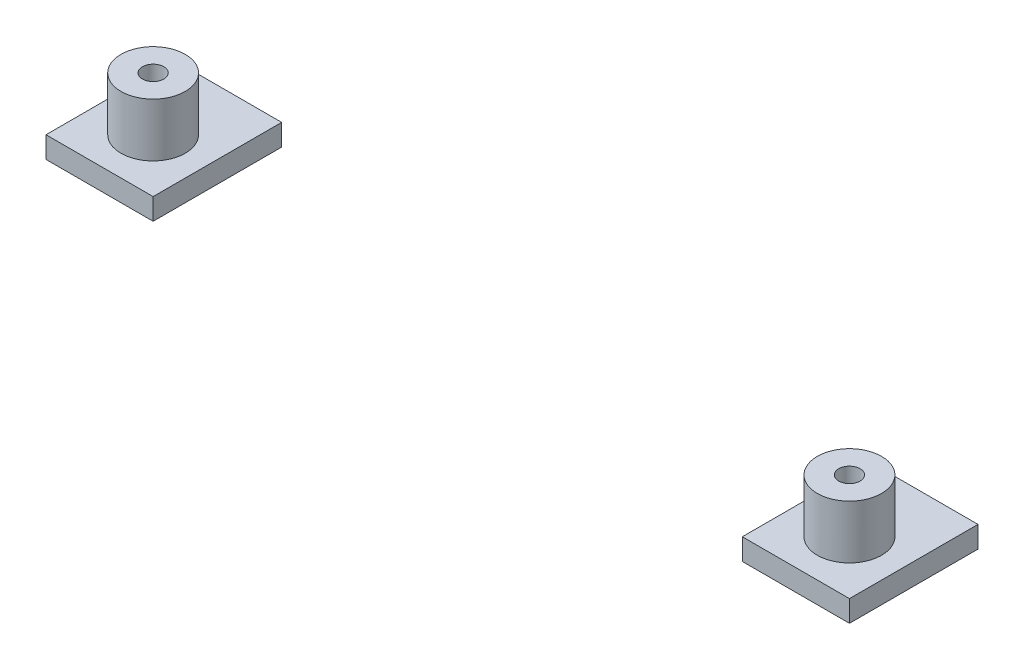
ISO-10303-21;
HEADER;
FILE_DESCRIPTION(('STEP AP214'),'2;1');
FILE_NAME('part.step','',(''),(''),'','','');
FILE_SCHEMA(('AUTOMOTIVE_DESIGN { 1 0 10303 214 1 1 1 1 }'));
ENDSEC;
DATA;
#1=APPLICATION_CONTEXT('core data for automotive mechanical design processes');
#2=APPLICATION_PROTOCOL_DEFINITION('international standard','automotive_design',2000,#1);
#3=PRODUCT_CONTEXT('',#1,'mechanical');
#4=PRODUCT('Part','Part','',(#3));
#5=PRODUCT_RELATED_PRODUCT_CATEGORY('part','',(#4));
#6=PRODUCT_DEFINITION_FORMATION('','',#4);
#7=PRODUCT_DEFINITION_CONTEXT('part definition',#1,'design');
#8=PRODUCT_DEFINITION('design','',#6,#7);
#9=PRODUCT_DEFINITION_SHAPE('','',#8);
#10=(LENGTH_UNIT() NAMED_UNIT(*) SI_UNIT(.MILLI.,.METRE.));
#11=(NAMED_UNIT(*) PLANE_ANGLE_UNIT() SI_UNIT($,.RADIAN.));
#12=(NAMED_UNIT(*) SI_UNIT($,.STERADIAN.) SOLID_ANGLE_UNIT());
#13=UNCERTAINTY_MEASURE_WITH_UNIT(LENGTH_MEASURE(1.E-05),#10,'distance_accuracy_value','');
#14=(GEOMETRIC_REPRESENTATION_CONTEXT(3) GLOBAL_UNCERTAINTY_ASSIGNED_CONTEXT((#13)) GLOBAL_UNIT_ASSIGNED_CONTEXT((#10,
#11,#12)) REPRESENTATION_CONTEXT('',''));
#15=CARTESIAN_POINT('',(0.,0.,0.));
#16=DIRECTION('',(0.,0.,1.));
#17=DIRECTION('',(1.,0.,0.));
#18=AXIS2_PLACEMENT_3D('',#15,#16,#17);
#19=CARTESIAN_POINT('',(37.5,2.,85.0266619276108));
#20=DIRECTION('',(0.,-1.,0.));
#21=DIRECTION('',(0.,0.,-1.));
#22=AXIS2_PLACEMENT_3D('',#19,#20,#21);
#23=PLANE('',#22);
#24=CARTESIAN_POINT('',(32.5,2.,5.));
#25=DIRECTION('',(0.,-1.,0.));
#26=DIRECTION('',(0.,0.,-1.));
#27=AXIS2_PLACEMENT_3D('',#24,#25,#26);
#28=CIRCLE('',#27,3.);
#29=CARTESIAN_POINT('',(32.5,2.,2.));
#30=VERTEX_POINT('',#29);
#31=EDGE_CURVE('E115',#30,#30,#28,.F.);
#32=ORIENTED_EDGE('',*,*,#31,.F.);
#33=EDGE_LOOP('',(#32));
#34=FACE_BOUND('',#33,.T.);
#35=DIRECTION('',(0.,0.,-1.));
#36=VECTOR('',#35,1.);
#37=CARTESIAN_POINT('',(37.5,2.,85.0266619276108));
#38=LINE('',#37,#36);
#39=CARTESIAN_POINT('',(37.5,2.,9.99999999999999));
#40=VERTEX_POINT('',#39);
#41=CARTESIAN_POINT('',(37.5,2.,-2.));
#42=VERTEX_POINT('',#41);
#43=EDGE_CURVE('E78',#40,#42,#38,.T.);
#44=ORIENTED_EDGE('',*,*,#43,.T.);
#45=DIRECTION('',(1.,0.,0.));
#46=VECTOR('',#45,1.);
#47=CARTESIAN_POINT('',(27.5,2.,-2.));
#48=LINE('',#47,#46);
#49=CARTESIAN_POINT('',(27.5,2.,-2.));
#50=VERTEX_POINT('',#49);
#51=EDGE_CURVE('E108',#50,#42,#48,.T.);
#52=ORIENTED_EDGE('',*,*,#51,.F.);
#53=DIRECTION('',(0.,0.,-1.));
#54=VECTOR('',#53,1.);
#55=CARTESIAN_POINT('',(27.5,2.,0.));
#56=LINE('',#55,#54);
#57=CARTESIAN_POINT('',(27.5,2.,9.99999999999999));
#58=VERTEX_POINT('',#57);
#59=EDGE_CURVE('E12',#58,#50,#56,.T.);
#60=ORIENTED_EDGE('',*,*,#59,.F.);
#61=DIRECTION('',(-1.,0.,0.));
#62=VECTOR('',#61,1.);
#63=CARTESIAN_POINT('',(37.5,2.,9.99999999999999));
#64=LINE('',#63,#62);
#65=EDGE_CURVE('E74',#40,#58,#64,.T.);
#66=ORIENTED_EDGE('',*,*,#65,.F.);
#67=EDGE_LOOP('',(#44,#52,#60,#66));
#68=FACE_BOUND('',#67,.T.);
#69=ADVANCED_FACE('F43',(#34,#68),#23,.F.);
#70=CARTESIAN_POINT('',(-37.5,0.,85.0266619276108));
#71=DIRECTION('',(0.,1.,0.));
#72=DIRECTION('',(0.,0.,1.));
#73=AXIS2_PLACEMENT_3D('',#70,#71,#72);
#74=PLANE('',#73);
#75=CARTESIAN_POINT('',(32.5,0.,5.));
#76=DIRECTION('',(0.,1.,0.));
#77=DIRECTION('',(0.,0.,1.));
#78=AXIS2_PLACEMENT_3D('',#75,#76,#77);
#79=CIRCLE('',#78,0.999999999999998);
#80=CARTESIAN_POINT('',(32.5,0.,6.));
#81=VERTEX_POINT('',#80);
#82=EDGE_CURVE('E119',#81,#81,#79,.T.);
#83=ORIENTED_EDGE('',*,*,#82,.T.);
#84=EDGE_LOOP('',(#83));
#85=FACE_BOUND('',#84,.T.);
#86=DIRECTION('',(1.,0.,0.));
#87=VECTOR('',#86,1.);
#88=CARTESIAN_POINT('',(-37.5,0.,9.99999999999999));
#89=LINE('',#88,#87);
#90=CARTESIAN_POINT('',(27.5,0.,9.99999999999999));
#91=VERTEX_POINT('',#90);
#92=CARTESIAN_POINT('',(37.5,0.,9.99999999999999));
#93=VERTEX_POINT('',#92);
#94=EDGE_CURVE('E46',#91,#93,#89,.T.);
#95=ORIENTED_EDGE('',*,*,#94,.F.);
#96=DIRECTION('',(0.,0.,-1.));
#97=VECTOR('',#96,1.);
#98=CARTESIAN_POINT('',(27.5,0.,85.0266619276108));
#99=LINE('',#98,#97);
#100=CARTESIAN_POINT('',(27.5,0.,-2.));
#101=VERTEX_POINT('',#100);
#102=EDGE_CURVE('E60',#91,#101,#99,.T.);
#103=ORIENTED_EDGE('',*,*,#102,.T.);
#104=DIRECTION('',(-1.,0.,0.));
#105=VECTOR('',#104,1.);
#106=CARTESIAN_POINT('',(37.5,0.,-2.));
#107=LINE('',#106,#105);
#108=CARTESIAN_POINT('',(37.5,0.,-2.));
#109=VERTEX_POINT('',#108);
#110=EDGE_CURVE('E102',#109,#101,#107,.T.);
#111=ORIENTED_EDGE('',*,*,#110,.F.);
#112=DIRECTION('',(0.,0.,-1.));
#113=VECTOR('',#112,1.);
#114=CARTESIAN_POINT('',(37.5,0.,85.0266619276108));
#115=LINE('',#114,#113);
#116=EDGE_CURVE('E90',#93,#109,#115,.T.);
#117=ORIENTED_EDGE('',*,*,#116,.F.);
#118=EDGE_LOOP('',(#95,#103,#111,#117));
#119=FACE_BOUND('',#118,.T.);
#120=ADVANCED_FACE('F103',(#85,#119),#74,.F.);
#121=CARTESIAN_POINT('',(37.5,-28.,10.));
#122=DIRECTION('',(0.,0.,1.));
#123=DIRECTION('',(0.,1.,0.));
#124=AXIS2_PLACEMENT_3D('',#121,#122,#123);
#125=PLANE('',#124);
#126=DIRECTION('',(0.,1.,0.));
#127=VECTOR('',#126,1.);
#128=CARTESIAN_POINT('',(27.5,-28.,10.));
#129=LINE('',#128,#127);
#130=EDGE_CURVE('E52',#91,#58,#129,.T.);
#131=ORIENTED_EDGE('',*,*,#130,.F.);
#132=ORIENTED_EDGE('',*,*,#94,.T.);
#133=DIRECTION('',(0.,1.,0.));
#134=VECTOR('',#133,1.);
#135=CARTESIAN_POINT('',(37.5,2.,9.99999999999999));
#136=LINE('',#135,#134);
#137=EDGE_CURVE('E96',#93,#40,#136,.T.);
#138=ORIENTED_EDGE('',*,*,#137,.T.);
#139=ORIENTED_EDGE('',*,*,#65,.T.);
#140=EDGE_LOOP('',(#131,#132,#138,#139));
#141=FACE_BOUND('',#140,.T.);
#142=ADVANCED_FACE('F128',(#141),#125,.T.);
#143=CARTESIAN_POINT('',(37.5,2.,85.0266619276108));
#144=DIRECTION('',(-1.,0.,0.));
#145=DIRECTION('',(0.,0.,1.));
#146=AXIS2_PLACEMENT_3D('',#143,#144,#145);
#147=PLANE('',#146);
#148=ORIENTED_EDGE('',*,*,#137,.F.);
#149=ORIENTED_EDGE('',*,*,#116,.T.);
#150=DIRECTION('',(0.,-1.,0.));
#151=VECTOR('',#150,1.);
#152=CARTESIAN_POINT('',(37.5,2.,-2.));
#153=LINE('',#152,#151);
#154=EDGE_CURVE('E94',#42,#109,#153,.T.);
#155=ORIENTED_EDGE('',*,*,#154,.F.);
#156=ORIENTED_EDGE('',*,*,#43,.F.);
#157=EDGE_LOOP('',(#148,#149,#155,#156));
#158=FACE_BOUND('',#157,.T.);
#159=ADVANCED_FACE('F92',(#158),#147,.F.);
#160=CARTESIAN_POINT('',(32.5,7.,5.));
#161=DIRECTION('',(0.,1.,0.));
#162=DIRECTION('',(0.,0.,1.));
#163=AXIS2_PLACEMENT_3D('',#160,#161,#162);
#164=PLANE('',#163);
#165=CARTESIAN_POINT('',(32.5,7.,5.));
#166=DIRECTION('',(0.,1.,0.));
#167=DIRECTION('',(0.,0.,1.));
#168=AXIS2_PLACEMENT_3D('',#165,#166,#167);
#169=CIRCLE('',#168,3.);
#170=CARTESIAN_POINT('',(32.5,7.,8.));
#171=VERTEX_POINT('',#170);
#172=EDGE_CURVE('E99',#171,#171,#169,.T.);
#173=ORIENTED_EDGE('',*,*,#172,.T.);
#174=EDGE_LOOP('',(#173));
#175=FACE_BOUND('',#174,.T.);
#176=CARTESIAN_POINT('',(32.5,7.,5.));
#177=DIRECTION('',(0.,1.,0.));
#178=DIRECTION('',(0.,0.,1.));
#179=AXIS2_PLACEMENT_3D('',#176,#177,#178);
#180=CIRCLE('',#179,0.999999999999998);
#181=CARTESIAN_POINT('',(32.5,7.,6.));
#182=VERTEX_POINT('',#181);
#183=EDGE_CURVE('E114',#182,#182,#180,.T.);
#184=ORIENTED_EDGE('',*,*,#183,.F.);
#185=EDGE_LOOP('',(#184));
#186=FACE_BOUND('',#185,.T.);
#187=ADVANCED_FACE('F141',(#175,#186),#164,.T.);
#188=CARTESIAN_POINT('',(32.5,7.,5.));
#189=DIRECTION('',(0.,-1.,0.));
#190=DIRECTION('',(0.,0.,-1.));
#191=AXIS2_PLACEMENT_3D('',#188,#189,#190);
#192=CYLINDRICAL_SURFACE('',#191,3.);
#193=ORIENTED_EDGE('',*,*,#172,.F.);
#194=EDGE_LOOP('',(#193));
#195=FACE_BOUND('',#194,.T.);
#196=ORIENTED_EDGE('',*,*,#31,.T.);
#197=EDGE_LOOP('',(#196));
#198=FACE_BOUND('',#197,.T.);
#199=ADVANCED_FACE('F138',(#195,#198),#192,.T.);
#200=CARTESIAN_POINT('',(32.5,7.,5.));
#201=DIRECTION('',(0.,-1.,0.));
#202=DIRECTION('',(0.,0.,-1.));
#203=AXIS2_PLACEMENT_3D('',#200,#201,#202);
#204=CYLINDRICAL_SURFACE('',#203,0.999999999999998);
#205=ORIENTED_EDGE('',*,*,#183,.T.);
#206=EDGE_LOOP('',(#205));
#207=FACE_BOUND('',#206,.T.);
#208=ORIENTED_EDGE('',*,*,#82,.F.);
#209=EDGE_LOOP('',(#208));
#210=FACE_BOUND('',#209,.T.);
#211=ADVANCED_FACE('F140',(#207,#210),#204,.F.);
#212=CARTESIAN_POINT('',(27.5,-8.,0.));
#213=DIRECTION('',(1.,0.,0.));
#214=DIRECTION('',(0.,0.,-1.));
#215=AXIS2_PLACEMENT_3D('',#212,#213,#214);
#216=PLANE('',#215);
#217=ORIENTED_EDGE('',*,*,#130,.T.);
#218=ORIENTED_EDGE('',*,*,#59,.T.);
#219=DIRECTION('',(0.,1.,0.));
#220=VECTOR('',#219,1.);
#221=CARTESIAN_POINT('',(27.5,0.,-2.));
#222=LINE('',#221,#220);
#223=EDGE_CURVE('E105',#101,#50,#222,.T.);
#224=ORIENTED_EDGE('',*,*,#223,.F.);
#225=ORIENTED_EDGE('',*,*,#102,.F.);
#226=EDGE_LOOP('',(#217,#218,#224,#225));
#227=FACE_BOUND('',#226,.T.);
#228=ADVANCED_FACE('F129',(#227),#216,.F.);
#229=CARTESIAN_POINT('',(37.5,0.,-2.));
#230=DIRECTION('',(0.,0.,-1.));
#231=DIRECTION('',(-1.,0.,0.));
#232=AXIS2_PLACEMENT_3D('',#229,#230,#231);
#233=PLANE('',#232);
#234=ORIENTED_EDGE('',*,*,#154,.T.);
#235=ORIENTED_EDGE('',*,*,#110,.T.);
#236=ORIENTED_EDGE('',*,*,#223,.T.);
#237=ORIENTED_EDGE('',*,*,#51,.T.);
#238=EDGE_LOOP('',(#234,#235,#236,#237));
#239=FACE_BOUND('',#238,.T.);
#240=ADVANCED_FACE('F107',(#239),#233,.T.);
#241=CLOSED_SHELL('',(#69,#120,#142,#159,#187,#199,#211,#228,#240));
#242=MANIFOLD_SOLID_BREP('B2',#241);
#243=CARTESIAN_POINT('',(-32.5,7.,5.00000000000001));
#244=DIRECTION('',(0.,-1.,0.));
#245=DIRECTION('',(0.,0.,-1.));
#246=AXIS2_PLACEMENT_3D('',#243,#244,#245);
#247=PLANE('',#246);
#248=CARTESIAN_POINT('',(-32.5,7.,5.00000000000001));
#249=DIRECTION('',(0.,1.,0.));
#250=DIRECTION('',(0.,0.,-1.));
#251=AXIS2_PLACEMENT_3D('',#248,#249,#250);
#252=CIRCLE('',#251,3.);
#253=CARTESIAN_POINT('',(-32.5,7.,2.));
#254=VERTEX_POINT('',#253);
#255=EDGE_CURVE('E281',#254,#254,#252,.T.);
#256=ORIENTED_EDGE('',*,*,#255,.T.);
#257=EDGE_LOOP('',(#256));
#258=FACE_BOUND('',#257,.T.);
#259=CARTESIAN_POINT('',(-32.5,7.,5.00000000000001));
#260=DIRECTION('',(0.,1.,0.));
#261=DIRECTION('',(0.,0.,-1.));
#262=AXIS2_PLACEMENT_3D('',#259,#260,#261);
#263=CIRCLE('',#262,0.999999999999998);
#264=CARTESIAN_POINT('',(-32.5,7.,4.00000000000001));
#265=VERTEX_POINT('',#264);
#266=EDGE_CURVE('E306',#265,#265,#263,.T.);
#267=ORIENTED_EDGE('',*,*,#266,.F.);
#268=EDGE_LOOP('',(#267));
#269=FACE_BOUND('',#268,.T.);
#270=ADVANCED_FACE('F233',(#258,#269),#247,.F.);
#271=CARTESIAN_POINT('',(-32.5,7.,5.00000000000001));
#272=DIRECTION('',(0.,-1.,0.));
#273=DIRECTION('',(0.,0.,-1.));
#274=AXIS2_PLACEMENT_3D('',#271,#272,#273);
#275=CYLINDRICAL_SURFACE('',#274,3.);
#276=ORIENTED_EDGE('',*,*,#255,.F.);
#277=EDGE_LOOP('',(#276));
#278=FACE_BOUND('',#277,.T.);
#279=CARTESIAN_POINT('',(-32.5,2.,5.00000000000001));
#280=DIRECTION('',(0.,-1.,0.));
#281=DIRECTION('',(0.,0.,-1.));
#282=AXIS2_PLACEMENT_3D('',#279,#280,#281);
#283=CIRCLE('',#282,3.);
#284=CARTESIAN_POINT('',(-32.5,2.,2.));
#285=VERTEX_POINT('',#284);
#286=EDGE_CURVE('E241',#285,#285,#283,.F.);
#287=ORIENTED_EDGE('',*,*,#286,.T.);
#288=EDGE_LOOP('',(#287));
#289=FACE_BOUND('',#288,.T.);
#290=ADVANCED_FACE('F320',(#278,#289),#275,.T.);
#291=CARTESIAN_POINT('',(-32.5,7.,5.00000000000001));
#292=DIRECTION('',(0.,-1.,0.));
#293=DIRECTION('',(0.,0.,-1.));
#294=AXIS2_PLACEMENT_3D('',#291,#292,#293);
#295=CYLINDRICAL_SURFACE('',#294,0.999999999999998);
#296=ORIENTED_EDGE('',*,*,#266,.T.);
#297=EDGE_LOOP('',(#296));
#298=FACE_BOUND('',#297,.T.);
#299=CARTESIAN_POINT('',(-32.5,0.,5.00000000000001));
#300=DIRECTION('',(0.,1.,0.));
#301=DIRECTION('',(0.,0.,1.));
#302=AXIS2_PLACEMENT_3D('',#299,#300,#301);
#303=CIRCLE('',#302,0.999999999999998);
#304=CARTESIAN_POINT('',(-32.5,0.,6.));
#305=VERTEX_POINT('',#304);
#306=EDGE_CURVE('E303',#305,#305,#303,.T.);
#307=ORIENTED_EDGE('',*,*,#306,.F.);
#308=EDGE_LOOP('',(#307));
#309=FACE_BOUND('',#308,.T.);
#310=ADVANCED_FACE('F338',(#298,#309),#295,.F.);
#311=CARTESIAN_POINT('',(-37.5,2.,85.0266619276108));
#312=DIRECTION('',(1.,0.,0.));
#313=DIRECTION('',(0.,0.,-1.));
#314=AXIS2_PLACEMENT_3D('',#311,#312,#313);
#315=PLANE('',#314);
#316=DIRECTION('',(0.,-1.,0.));
#317=VECTOR('',#316,1.);
#318=CARTESIAN_POINT('',(-37.5,2.,9.99999999999999));
#319=LINE('',#318,#317);
#320=CARTESIAN_POINT('',(-37.5,2.,9.99999999999999));
#321=VERTEX_POINT('',#320);
#322=CARTESIAN_POINT('',(-37.5,0.,9.99999999999999));
#323=VERTEX_POINT('',#322);
#324=EDGE_CURVE('E278',#321,#323,#319,.T.);
#325=ORIENTED_EDGE('',*,*,#324,.F.);
#326=DIRECTION('',(0.,0.,-1.));
#327=VECTOR('',#326,1.);
#328=CARTESIAN_POINT('',(-37.5,2.,85.0266619276108));
#329=LINE('',#328,#327);
#330=CARTESIAN_POINT('',(-37.5,2.,-2.));
#331=VERTEX_POINT('',#330);
#332=EDGE_CURVE('E272',#321,#331,#329,.T.);
#333=ORIENTED_EDGE('',*,*,#332,.T.);
#334=DIRECTION('',(0.,1.,0.));
#335=VECTOR('',#334,1.);
#336=CARTESIAN_POINT('',(-37.5,0.,-2.));
#337=LINE('',#336,#335);
#338=CARTESIAN_POINT('',(-37.5,0.,-2.));
#339=VERTEX_POINT('',#338);
#340=EDGE_CURVE('E276',#339,#331,#337,.T.);
#341=ORIENTED_EDGE('',*,*,#340,.F.);
#342=DIRECTION('',(0.,0.,-1.));
#343=VECTOR('',#342,1.);
#344=CARTESIAN_POINT('',(-37.5,0.,85.0266619276108));
#345=LINE('',#344,#343);
#346=EDGE_CURVE('E256',#323,#339,#345,.T.);
#347=ORIENTED_EDGE('',*,*,#346,.F.);
#348=EDGE_LOOP('',(#325,#333,#341,#347));
#349=FACE_BOUND('',#348,.T.);
#350=ADVANCED_FACE('F274',(#349),#315,.F.);
#351=CARTESIAN_POINT('',(37.5,-28.,10.));
#352=DIRECTION('',(0.,0.,1.));
#353=DIRECTION('',(0.,1.,0.));
#354=AXIS2_PLACEMENT_3D('',#351,#352,#353);
#355=PLANE('',#354);
#356=DIRECTION('',(0.,-1.,0.));
#357=VECTOR('',#356,1.);
#358=CARTESIAN_POINT('',(-27.5,-28.,10.));
#359=LINE('',#358,#357);
#360=CARTESIAN_POINT('',(-27.5,2.,9.99999999999999));
#361=VERTEX_POINT('',#360);
#362=CARTESIAN_POINT('',(-27.5,0.,9.99999999999999));
#363=VERTEX_POINT('',#362);
#364=EDGE_CURVE('E41',#361,#363,#359,.T.);
#365=ORIENTED_EDGE('',*,*,#364,.F.);
#366=DIRECTION('',(-1.,0.,0.));
#367=VECTOR('',#366,1.);
#368=CARTESIAN_POINT('',(37.5,2.,9.99999999999999));
#369=LINE('',#368,#367);
#370=EDGE_CURVE('E312',#361,#321,#369,.T.);
#371=ORIENTED_EDGE('',*,*,#370,.T.);
#372=ORIENTED_EDGE('',*,*,#324,.T.);
#373=DIRECTION('',(1.,0.,0.));
#374=VECTOR('',#373,1.);
#375=CARTESIAN_POINT('',(-37.5,0.,9.99999999999999));
#376=LINE('',#375,#374);
#377=EDGE_CURVE('E314',#323,#363,#376,.T.);
#378=ORIENTED_EDGE('',*,*,#377,.T.);
#379=EDGE_LOOP('',(#365,#371,#372,#378));
#380=FACE_BOUND('',#379,.T.);
#381=ADVANCED_FACE('F235',(#380),#355,.T.);
#382=CARTESIAN_POINT('',(-37.5,0.,85.0266619276108));
#383=DIRECTION('',(0.,1.,0.));
#384=DIRECTION('',(0.,0.,1.));
#385=AXIS2_PLACEMENT_3D('',#382,#383,#384);
#386=PLANE('',#385);
#387=ORIENTED_EDGE('',*,*,#306,.T.);
#388=EDGE_LOOP('',(#387));
#389=FACE_BOUND('',#388,.T.);
#390=ORIENTED_EDGE('',*,*,#346,.T.);
#391=DIRECTION('',(-1.,0.,0.));
#392=VECTOR('',#391,1.);
#393=CARTESIAN_POINT('',(-27.5,0.,-2.));
#394=LINE('',#393,#392);
#395=CARTESIAN_POINT('',(-27.5,0.,-2.));
#396=VERTEX_POINT('',#395);
#397=EDGE_CURVE('E294',#396,#339,#394,.T.);
#398=ORIENTED_EDGE('',*,*,#397,.F.);
#399=DIRECTION('',(0.,0.,1.));
#400=VECTOR('',#399,1.);
#401=CARTESIAN_POINT('',(-27.5,0.,85.0266619276108));
#402=LINE('',#401,#400);
#403=EDGE_CURVE('E300',#396,#363,#402,.T.);
#404=ORIENTED_EDGE('',*,*,#403,.T.);
#405=ORIENTED_EDGE('',*,*,#377,.F.);
#406=EDGE_LOOP('',(#390,#398,#404,#405));
#407=FACE_BOUND('',#406,.T.);
#408=ADVANCED_FACE('F323',(#389,#407),#386,.F.);
#409=CARTESIAN_POINT('',(37.5,2.,85.0266619276108));
#410=DIRECTION('',(0.,-1.,0.));
#411=DIRECTION('',(0.,0.,-1.));
#412=AXIS2_PLACEMENT_3D('',#409,#410,#411);
#413=PLANE('',#412);
#414=ORIENTED_EDGE('',*,*,#370,.F.);
#415=DIRECTION('',(0.,0.,1.));
#416=VECTOR('',#415,1.);
#417=CARTESIAN_POINT('',(-27.5,2.,0.));
#418=LINE('',#417,#416);
#419=CARTESIAN_POINT('',(-27.5,2.,-2.));
#420=VERTEX_POINT('',#419);
#421=EDGE_CURVE('E247',#420,#361,#418,.T.);
#422=ORIENTED_EDGE('',*,*,#421,.F.);
#423=DIRECTION('',(1.,0.,0.));
#424=VECTOR('',#423,1.);
#425=CARTESIAN_POINT('',(-37.5,2.,-2.));
#426=LINE('',#425,#424);
#427=EDGE_CURVE('E284',#331,#420,#426,.T.);
#428=ORIENTED_EDGE('',*,*,#427,.F.);
#429=ORIENTED_EDGE('',*,*,#332,.F.);
#430=EDGE_LOOP('',(#414,#422,#428,#429));
#431=FACE_BOUND('',#430,.T.);
#432=ORIENTED_EDGE('',*,*,#286,.F.);
#433=EDGE_LOOP('',(#432));
#434=FACE_BOUND('',#433,.T.);
#435=ADVANCED_FACE('F285',(#431,#434),#413,.F.);
#436=CARTESIAN_POINT('',(-27.5,-8.,0.));
#437=DIRECTION('',(-1.,0.,0.));
#438=DIRECTION('',(0.,0.,1.));
#439=AXIS2_PLACEMENT_3D('',#436,#437,#438);
#440=PLANE('',#439);
#441=ORIENTED_EDGE('',*,*,#403,.F.);
#442=DIRECTION('',(0.,-1.,0.));
#443=VECTOR('',#442,1.);
#444=CARTESIAN_POINT('',(-27.5,2.,-2.));
#445=LINE('',#444,#443);
#446=EDGE_CURVE('E289',#420,#396,#445,.T.);
#447=ORIENTED_EDGE('',*,*,#446,.F.);
#448=ORIENTED_EDGE('',*,*,#421,.T.);
#449=ORIENTED_EDGE('',*,*,#364,.T.);
#450=EDGE_LOOP('',(#441,#447,#448,#449));
#451=FACE_BOUND('',#450,.T.);
#452=ADVANCED_FACE('F322',(#451),#440,.F.);
#453=CARTESIAN_POINT('',(-37.5,2.,-2.));
#454=DIRECTION('',(0.,0.,-1.));
#455=DIRECTION('',(-1.,0.,0.));
#456=AXIS2_PLACEMENT_3D('',#453,#454,#455);
#457=PLANE('',#456);
#458=ORIENTED_EDGE('',*,*,#340,.T.);
#459=ORIENTED_EDGE('',*,*,#427,.T.);
#460=ORIENTED_EDGE('',*,*,#446,.T.);
#461=ORIENTED_EDGE('',*,*,#397,.T.);
#462=EDGE_LOOP('',(#458,#459,#460,#461));
#463=FACE_BOUND('',#462,.T.);
#464=ADVANCED_FACE('F292',(#463),#457,.T.);
#465=CLOSED_SHELL('',(#270,#290,#310,#350,#381,#408,#435,#452,#464));
#466=MANIFOLD_SOLID_BREP('B6',#465);
#467=ADVANCED_BREP_SHAPE_REPRESENTATION('',(#18,#242,#466),#14);
#468=SHAPE_DEFINITION_REPRESENTATION(#9,#467);
ENDSEC;
END-ISO-10303-21;
